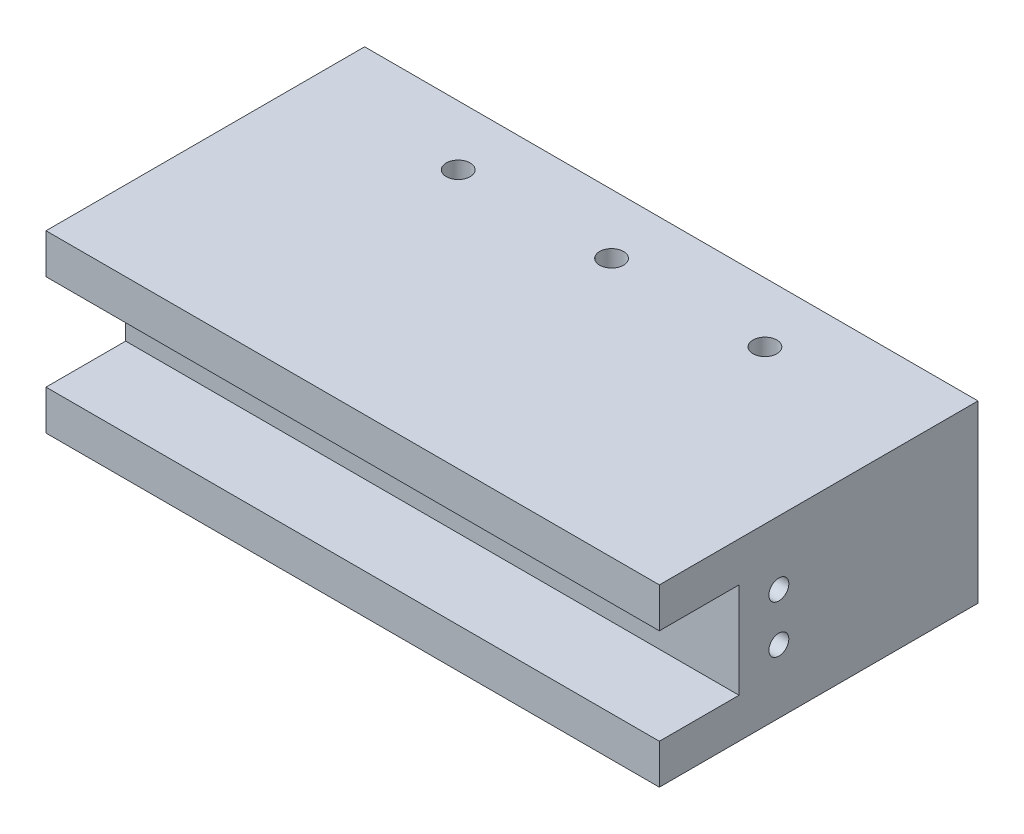
ISO-10303-21;
HEADER;
FILE_DESCRIPTION(('STEP AP214'),'2;1');
FILE_NAME('part.step','',(''),(''),'','','');
FILE_SCHEMA(('AUTOMOTIVE_DESIGN { 1 0 10303 214 1 1 1 1 }'));
ENDSEC;
DATA;
#1=APPLICATION_CONTEXT('core data for automotive mechanical design processes');
#2=APPLICATION_PROTOCOL_DEFINITION('international standard','automotive_design',2000,#1);
#3=PRODUCT_CONTEXT('',#1,'mechanical');
#4=PRODUCT('Part','Part','',(#3));
#5=PRODUCT_RELATED_PRODUCT_CATEGORY('part','',(#4));
#6=PRODUCT_DEFINITION_FORMATION('','',#4);
#7=PRODUCT_DEFINITION_CONTEXT('part definition',#1,'design');
#8=PRODUCT_DEFINITION('design','',#6,#7);
#9=PRODUCT_DEFINITION_SHAPE('','',#8);
#10=(LENGTH_UNIT() NAMED_UNIT(*) SI_UNIT(.MILLI.,.METRE.));
#11=(NAMED_UNIT(*) PLANE_ANGLE_UNIT() SI_UNIT($,.RADIAN.));
#12=(NAMED_UNIT(*) SI_UNIT($,.STERADIAN.) SOLID_ANGLE_UNIT());
#13=UNCERTAINTY_MEASURE_WITH_UNIT(LENGTH_MEASURE(1.E-05),#10,'distance_accuracy_value','');
#14=(GEOMETRIC_REPRESENTATION_CONTEXT(3) GLOBAL_UNCERTAINTY_ASSIGNED_CONTEXT((#13)) GLOBAL_UNIT_ASSIGNED_CONTEXT((#10,
#11,#12)) REPRESENTATION_CONTEXT('',''));
#15=CARTESIAN_POINT('',(0.,0.,0.));
#16=DIRECTION('',(0.,0.,1.));
#17=DIRECTION('',(1.,0.,0.));
#18=AXIS2_PLACEMENT_3D('',#15,#16,#17);
#19=CARTESIAN_POINT('',(0.,0.,10.));
#20=DIRECTION('',(1.,0.,0.));
#21=DIRECTION('',(0.,0.,-1.));
#22=AXIS2_PLACEMENT_3D('',#19,#20,#21);
#23=PLANE('',#22);
#24=CARTESIAN_POINT('',(0.,6.,6.));
#25=DIRECTION('',(-1.,0.,0.));
#26=DIRECTION('',(0.,0.,1.));
#27=AXIS2_PLACEMENT_3D('',#24,#25,#26);
#28=CIRCLE('',#27,1.25);
#29=CARTESIAN_POINT('',(0.,6.,7.25));
#30=VERTEX_POINT('',#29);
#31=EDGE_CURVE('E133',#30,#30,#28,.T.);
#32=ORIENTED_EDGE('',*,*,#31,.F.);
#33=EDGE_LOOP('',(#32));
#34=FACE_BOUND('',#33,.T.);
#35=DIRECTION('',(0.,0.,1.));
#36=VECTOR('',#35,1.);
#37=CARTESIAN_POINT('',(0.,17.,0.));
#38=LINE('',#37,#36);
#39=CARTESIAN_POINT('',(0.,17.,-20.));
#40=VERTEX_POINT('',#39);
#41=CARTESIAN_POINT('',(0.,17.,20.));
#42=VERTEX_POINT('',#41);
#43=EDGE_CURVE('E97',#40,#42,#38,.T.);
#44=ORIENTED_EDGE('',*,*,#43,.F.);
#45=DIRECTION('',(0.,1.,0.));
#46=VECTOR('',#45,1.);
#47=CARTESIAN_POINT('',(0.,-5.,-20.));
#48=LINE('',#47,#46);
#49=CARTESIAN_POINT('',(0.,-5.,-20.));
#50=VERTEX_POINT('',#49);
#51=EDGE_CURVE('E101',#50,#40,#48,.T.);
#52=ORIENTED_EDGE('',*,*,#51,.F.);
#53=DIRECTION('',(0.,0.,1.));
#54=VECTOR('',#53,1.);
#55=CARTESIAN_POINT('',(0.,-5.,0.));
#56=LINE('',#55,#54);
#57=CARTESIAN_POINT('',(0.,-5.,20.));
#58=VERTEX_POINT('',#57);
#59=EDGE_CURVE('E145',#50,#58,#56,.T.);
#60=ORIENTED_EDGE('',*,*,#59,.T.);
#61=DIRECTION('',(0.,1.,0.));
#62=VECTOR('',#61,1.);
#63=CARTESIAN_POINT('',(0.,-5.,20.));
#64=LINE('',#63,#62);
#65=CARTESIAN_POINT('',(0.,0.,20.));
#66=VERTEX_POINT('',#65);
#67=EDGE_CURVE('E147',#58,#66,#64,.T.);
#68=ORIENTED_EDGE('',*,*,#67,.T.);
#69=DIRECTION('',(0.,0.,1.));
#70=VECTOR('',#69,1.);
#71=CARTESIAN_POINT('',(0.,0.,0.));
#72=LINE('',#71,#70);
#73=CARTESIAN_POINT('',(0.,0.,10.));
#74=VERTEX_POINT('',#73);
#75=EDGE_CURVE('E142',#74,#66,#72,.T.);
#76=ORIENTED_EDGE('',*,*,#75,.F.);
#77=DIRECTION('',(0.,-1.,0.));
#78=VECTOR('',#77,1.);
#79=CARTESIAN_POINT('',(0.,0.,10.));
#80=LINE('',#79,#78);
#81=CARTESIAN_POINT('',(0.,12.,10.));
#82=VERTEX_POINT('',#81);
#83=EDGE_CURVE('E172',#82,#74,#80,.T.);
#84=ORIENTED_EDGE('',*,*,#83,.F.);
#85=DIRECTION('',(0.,0.,1.));
#86=VECTOR('',#85,1.);
#87=CARTESIAN_POINT('',(0.,12.,0.));
#88=LINE('',#87,#86);
#89=CARTESIAN_POINT('',(0.,12.,20.));
#90=VERTEX_POINT('',#89);
#91=EDGE_CURVE('E47',#82,#90,#88,.T.);
#92=ORIENTED_EDGE('',*,*,#91,.T.);
#93=DIRECTION('',(0.,-1.,0.));
#94=VECTOR('',#93,1.);
#95=CARTESIAN_POINT('',(0.,17.,20.));
#96=LINE('',#95,#94);
#97=EDGE_CURVE('E103',#42,#90,#96,.T.);
#98=ORIENTED_EDGE('',*,*,#97,.F.);
#99=EDGE_LOOP('',(#44,#52,#60,#68,#76,#84,#92,#98));
#100=FACE_BOUND('',#99,.T.);
#101=ADVANCED_FACE('F33',(#34,#100),#23,.F.);
#102=CARTESIAN_POINT('',(77.,0.,10.));
#103=DIRECTION('',(-1.,0.,0.));
#104=DIRECTION('',(0.,0.,1.));
#105=AXIS2_PLACEMENT_3D('',#102,#103,#104);
#106=PLANE('',#105);
#107=CARTESIAN_POINT('',(77.,3.,5.));
#108=DIRECTION('',(1.,0.,0.));
#109=DIRECTION('',(0.,0.,-1.));
#110=AXIS2_PLACEMENT_3D('',#107,#108,#109);
#111=CIRCLE('',#110,1.25);
#112=CARTESIAN_POINT('',(77.,3.,3.75));
#113=VERTEX_POINT('',#112);
#114=EDGE_CURVE('E173',#113,#113,#111,.T.);
#115=ORIENTED_EDGE('',*,*,#114,.F.);
#116=EDGE_LOOP('',(#115));
#117=FACE_BOUND('',#116,.T.);
#118=CARTESIAN_POINT('',(77.,9.,5.));
#119=DIRECTION('',(1.,0.,0.));
#120=DIRECTION('',(0.,0.,-1.));
#121=AXIS2_PLACEMENT_3D('',#118,#119,#120);
#122=CIRCLE('',#121,1.25);
#123=CARTESIAN_POINT('',(77.,9.,3.75));
#124=VERTEX_POINT('',#123);
#125=EDGE_CURVE('E176',#124,#124,#122,.T.);
#126=ORIENTED_EDGE('',*,*,#125,.F.);
#127=EDGE_LOOP('',(#126));
#128=FACE_BOUND('',#127,.T.);
#129=DIRECTION('',(0.,0.,-1.));
#130=VECTOR('',#129,1.);
#131=CARTESIAN_POINT('',(77.,-5.,0.));
#132=LINE('',#131,#130);
#133=CARTESIAN_POINT('',(77.,-5.,20.));
#134=VERTEX_POINT('',#133);
#135=CARTESIAN_POINT('',(77.,-5.,-20.));
#136=VERTEX_POINT('',#135);
#137=EDGE_CURVE('E139',#134,#136,#132,.T.);
#138=ORIENTED_EDGE('',*,*,#137,.T.);
#139=DIRECTION('',(0.,-1.,0.));
#140=VECTOR('',#139,1.);
#141=CARTESIAN_POINT('',(77.,-5.,-20.));
#142=LINE('',#141,#140);
#143=CARTESIAN_POINT('',(77.,17.,-20.));
#144=VERTEX_POINT('',#143);
#145=EDGE_CURVE('E116',#144,#136,#142,.T.);
#146=ORIENTED_EDGE('',*,*,#145,.F.);
#147=DIRECTION('',(0.,0.,-1.));
#148=VECTOR('',#147,1.);
#149=CARTESIAN_POINT('',(77.,17.,0.));
#150=LINE('',#149,#148);
#151=CARTESIAN_POINT('',(77.,17.,20.));
#152=VERTEX_POINT('',#151);
#153=EDGE_CURVE('E107',#152,#144,#150,.T.);
#154=ORIENTED_EDGE('',*,*,#153,.F.);
#155=DIRECTION('',(0.,-1.,0.));
#156=VECTOR('',#155,1.);
#157=CARTESIAN_POINT('',(77.,17.,20.));
#158=LINE('',#157,#156);
#159=CARTESIAN_POINT('',(77.,12.,20.));
#160=VERTEX_POINT('',#159);
#161=EDGE_CURVE('E160',#152,#160,#158,.T.);
#162=ORIENTED_EDGE('',*,*,#161,.T.);
#163=DIRECTION('',(0.,0.,-1.));
#164=VECTOR('',#163,1.);
#165=CARTESIAN_POINT('',(77.,12.,0.));
#166=LINE('',#165,#164);
#167=CARTESIAN_POINT('',(77.,12.,10.));
#168=VERTEX_POINT('',#167);
#169=EDGE_CURVE('E156',#160,#168,#166,.T.);
#170=ORIENTED_EDGE('',*,*,#169,.T.);
#171=DIRECTION('',(0.,1.,0.));
#172=VECTOR('',#171,1.);
#173=CARTESIAN_POINT('',(77.,0.,10.));
#174=LINE('',#173,#172);
#175=CARTESIAN_POINT('',(77.,0.,10.));
#176=VERTEX_POINT('',#175);
#177=EDGE_CURVE('E40',#176,#168,#174,.T.);
#178=ORIENTED_EDGE('',*,*,#177,.F.);
#179=DIRECTION('',(0.,0.,-1.));
#180=VECTOR('',#179,1.);
#181=CARTESIAN_POINT('',(77.,0.,0.));
#182=LINE('',#181,#180);
#183=CARTESIAN_POINT('',(77.,0.,20.));
#184=VERTEX_POINT('',#183);
#185=EDGE_CURVE('E54',#184,#176,#182,.T.);
#186=ORIENTED_EDGE('',*,*,#185,.F.);
#187=DIRECTION('',(0.,1.,0.));
#188=VECTOR('',#187,1.);
#189=CARTESIAN_POINT('',(77.,-5.,20.));
#190=LINE('',#189,#188);
#191=EDGE_CURVE('E154',#134,#184,#190,.T.);
#192=ORIENTED_EDGE('',*,*,#191,.F.);
#193=EDGE_LOOP('',(#138,#146,#154,#162,#170,#178,#186,#192));
#194=FACE_BOUND('',#193,.T.);
#195=ADVANCED_FACE('F190',(#117,#128,#194),#106,.F.);
#196=CARTESIAN_POINT('',(0.,0.,10.));
#197=DIRECTION('',(0.,0.,-1.));
#198=DIRECTION('',(-1.,0.,0.));
#199=AXIS2_PLACEMENT_3D('',#196,#197,#198);
#200=PLANE('',#199);
#201=ORIENTED_EDGE('',*,*,#83,.T.);
#202=DIRECTION('',(1.,0.,0.));
#203=VECTOR('',#202,1.);
#204=CARTESIAN_POINT('',(0.,0.,10.));
#205=LINE('',#204,#203);
#206=EDGE_CURVE('E183',#74,#176,#205,.T.);
#207=ORIENTED_EDGE('',*,*,#206,.T.);
#208=ORIENTED_EDGE('',*,*,#177,.T.);
#209=DIRECTION('',(-1.,0.,0.));
#210=VECTOR('',#209,1.);
#211=CARTESIAN_POINT('',(0.,12.,10.));
#212=LINE('',#211,#210);
#213=EDGE_CURVE('E11',#168,#82,#212,.T.);
#214=ORIENTED_EDGE('',*,*,#213,.T.);
#215=EDGE_LOOP('',(#201,#207,#208,#214));
#216=FACE_BOUND('',#215,.T.);
#217=ADVANCED_FACE('F187',(#216),#200,.F.);
#218=CARTESIAN_POINT('',(65.,9.,5.));
#219=DIRECTION('',(1.,0.,0.));
#220=DIRECTION('',(0.,0.,-1.));
#221=AXIS2_PLACEMENT_3D('',#218,#219,#220);
#222=CYLINDRICAL_SURFACE('',#221,1.25);
#223=CARTESIAN_POINT('',(65.,9.,5.));
#224=DIRECTION('',(1.,0.,0.));
#225=DIRECTION('',(0.,0.,-1.));
#226=AXIS2_PLACEMENT_3D('',#223,#224,#225);
#227=CIRCLE('',#226,1.25);
#228=CARTESIAN_POINT('',(65.,9.,3.75));
#229=VERTEX_POINT('',#228);
#230=EDGE_CURVE('E168',#229,#229,#227,.T.);
#231=ORIENTED_EDGE('',*,*,#230,.F.);
#232=EDGE_LOOP('',(#231));
#233=FACE_BOUND('',#232,.T.);
#234=ORIENTED_EDGE('',*,*,#125,.T.);
#235=EDGE_LOOP('',(#234));
#236=FACE_BOUND('',#235,.T.);
#237=ADVANCED_FACE('F344',(#233,#236),#222,.F.);
#238=CARTESIAN_POINT('',(65.,9.,5.));
#239=DIRECTION('',(1.,0.,0.));
#240=DIRECTION('',(0.,0.,-1.));
#241=AXIS2_PLACEMENT_3D('',#238,#239,#240);
#242=PLANE('',#241);
#243=ORIENTED_EDGE('',*,*,#230,.T.);
#244=EDGE_LOOP('',(#243));
#245=FACE_BOUND('',#244,.T.);
#246=ADVANCED_FACE('F385',(#245),#242,.T.);
#247=CARTESIAN_POINT('',(65.,3.,5.));
#248=DIRECTION('',(1.,0.,0.));
#249=DIRECTION('',(0.,0.,-1.));
#250=AXIS2_PLACEMENT_3D('',#247,#248,#249);
#251=CYLINDRICAL_SURFACE('',#250,1.25);
#252=CARTESIAN_POINT('',(65.,3.,5.));
#253=DIRECTION('',(1.,0.,0.));
#254=DIRECTION('',(0.,0.,-1.));
#255=AXIS2_PLACEMENT_3D('',#252,#253,#254);
#256=CIRCLE('',#255,1.25);
#257=CARTESIAN_POINT('',(65.,3.,3.75));
#258=VERTEX_POINT('',#257);
#259=EDGE_CURVE('E169',#258,#258,#256,.T.);
#260=ORIENTED_EDGE('',*,*,#259,.F.);
#261=EDGE_LOOP('',(#260));
#262=FACE_BOUND('',#261,.T.);
#263=ORIENTED_EDGE('',*,*,#114,.T.);
#264=EDGE_LOOP('',(#263));
#265=FACE_BOUND('',#264,.T.);
#266=ADVANCED_FACE('F374',(#262,#265),#251,.F.);
#267=CARTESIAN_POINT('',(65.,3.,5.));
#268=DIRECTION('',(1.,0.,0.));
#269=DIRECTION('',(0.,0.,-1.));
#270=AXIS2_PLACEMENT_3D('',#267,#268,#269);
#271=PLANE('',#270);
#272=ORIENTED_EDGE('',*,*,#259,.T.);
#273=EDGE_LOOP('',(#272));
#274=FACE_BOUND('',#273,.T.);
#275=ADVANCED_FACE('F364',(#274),#271,.T.);
#276=CARTESIAN_POINT('',(0.,12.,0.));
#277=DIRECTION('',(0.,-1.,0.));
#278=DIRECTION('',(1.,0.,0.));
#279=AXIS2_PLACEMENT_3D('',#276,#277,#278);
#280=PLANE('',#279);
#281=ORIENTED_EDGE('',*,*,#213,.F.);
#282=ORIENTED_EDGE('',*,*,#169,.F.);
#283=DIRECTION('',(1.,0.,0.));
#284=VECTOR('',#283,1.);
#285=CARTESIAN_POINT('',(77.,12.,20.));
#286=LINE('',#285,#284);
#287=EDGE_CURVE('E157',#90,#160,#286,.T.);
#288=ORIENTED_EDGE('',*,*,#287,.F.);
#289=ORIENTED_EDGE('',*,*,#91,.F.);
#290=EDGE_LOOP('',(#281,#282,#288,#289));
#291=FACE_BOUND('',#290,.T.);
#292=ADVANCED_FACE('F193',(#291),#280,.T.);
#293=CARTESIAN_POINT('',(77.,17.,20.));
#294=DIRECTION('',(0.,0.,-1.));
#295=DIRECTION('',(-1.,0.,0.));
#296=AXIS2_PLACEMENT_3D('',#293,#294,#295);
#297=PLANE('',#296);
#298=ORIENTED_EDGE('',*,*,#287,.T.);
#299=ORIENTED_EDGE('',*,*,#161,.F.);
#300=DIRECTION('',(1.,0.,0.));
#301=VECTOR('',#300,1.);
#302=CARTESIAN_POINT('',(77.,17.,20.));
#303=LINE('',#302,#301);
#304=EDGE_CURVE('E106',#42,#152,#303,.T.);
#305=ORIENTED_EDGE('',*,*,#304,.F.);
#306=ORIENTED_EDGE('',*,*,#97,.T.);
#307=EDGE_LOOP('',(#298,#299,#305,#306));
#308=FACE_BOUND('',#307,.T.);
#309=ADVANCED_FACE('F195',(#308),#297,.F.);
#310=CARTESIAN_POINT('',(0.,17.,0.));
#311=DIRECTION('',(0.,-1.,0.));
#312=DIRECTION('',(1.,0.,0.));
#313=AXIS2_PLACEMENT_3D('',#310,#311,#312);
#314=PLANE('',#313);
#315=CARTESIAN_POINT('',(19.25,17.,-12.5));
#316=DIRECTION('',(0.,-1.,0.));
#317=DIRECTION('',(1.,0.,0.));
#318=AXIS2_PLACEMENT_3D('',#315,#316,#317);
#319=CIRCLE('',#318,1.5);
#320=CARTESIAN_POINT('',(20.75,17.,-12.5));
#321=VERTEX_POINT('',#320);
#322=EDGE_CURVE('E122',#321,#321,#319,.T.);
#323=ORIENTED_EDGE('',*,*,#322,.T.);
#324=EDGE_LOOP('',(#323));
#325=FACE_BOUND('',#324,.T.);
#326=CARTESIAN_POINT('',(38.5,17.,-12.5));
#327=DIRECTION('',(0.,-1.,0.));
#328=DIRECTION('',(1.,0.,0.));
#329=AXIS2_PLACEMENT_3D('',#326,#327,#328);
#330=CIRCLE('',#329,1.5);
#331=CARTESIAN_POINT('',(40.,17.,-12.5));
#332=VERTEX_POINT('',#331);
#333=EDGE_CURVE('E260',#332,#332,#330,.T.);
#334=ORIENTED_EDGE('',*,*,#333,.T.);
#335=EDGE_LOOP('',(#334));
#336=FACE_BOUND('',#335,.T.);
#337=CARTESIAN_POINT('',(57.75,17.,-12.5));
#338=DIRECTION('',(0.,-1.,0.));
#339=DIRECTION('',(1.,0.,0.));
#340=AXIS2_PLACEMENT_3D('',#337,#338,#339);
#341=CIRCLE('',#340,1.5);
#342=CARTESIAN_POINT('',(59.25,17.,-12.5));
#343=VERTEX_POINT('',#342);
#344=EDGE_CURVE('E128',#343,#343,#341,.T.);
#345=ORIENTED_EDGE('',*,*,#344,.T.);
#346=EDGE_LOOP('',(#345));
#347=FACE_BOUND('',#346,.T.);
#348=ORIENTED_EDGE('',*,*,#153,.T.);
#349=DIRECTION('',(1.,0.,0.));
#350=VECTOR('',#349,1.);
#351=CARTESIAN_POINT('',(0.,17.,-20.));
#352=LINE('',#351,#350);
#353=EDGE_CURVE('E110',#40,#144,#352,.T.);
#354=ORIENTED_EDGE('',*,*,#353,.F.);
#355=ORIENTED_EDGE('',*,*,#43,.T.);
#356=ORIENTED_EDGE('',*,*,#304,.T.);
#357=EDGE_LOOP('',(#348,#354,#355,#356));
#358=FACE_BOUND('',#357,.T.);
#359=ADVANCED_FACE('F111',(#325,#336,#347,#358),#314,.F.);
#360=CARTESIAN_POINT('',(0.,0.,0.));
#361=DIRECTION('',(0.,1.,0.));
#362=DIRECTION('',(1.,0.,0.));
#363=AXIS2_PLACEMENT_3D('',#360,#361,#362);
#364=PLANE('',#363);
#365=ORIENTED_EDGE('',*,*,#206,.F.);
#366=ORIENTED_EDGE('',*,*,#75,.T.);
#367=DIRECTION('',(1.,0.,0.));
#368=VECTOR('',#367,1.);
#369=CARTESIAN_POINT('',(77.,0.,20.));
#370=LINE('',#369,#368);
#371=EDGE_CURVE('E149',#66,#184,#370,.T.);
#372=ORIENTED_EDGE('',*,*,#371,.T.);
#373=ORIENTED_EDGE('',*,*,#185,.T.);
#374=EDGE_LOOP('',(#365,#366,#372,#373));
#375=FACE_BOUND('',#374,.T.);
#376=ADVANCED_FACE('F204',(#375),#364,.T.);
#377=CARTESIAN_POINT('',(77.,-5.,20.));
#378=DIRECTION('',(0.,0.,1.));
#379=DIRECTION('',(1.,0.,0.));
#380=AXIS2_PLACEMENT_3D('',#377,#378,#379);
#381=PLANE('',#380);
#382=ORIENTED_EDGE('',*,*,#371,.F.);
#383=ORIENTED_EDGE('',*,*,#67,.F.);
#384=DIRECTION('',(1.,0.,0.));
#385=VECTOR('',#384,1.);
#386=CARTESIAN_POINT('',(77.,-5.,20.));
#387=LINE('',#386,#385);
#388=EDGE_CURVE('E141',#58,#134,#387,.T.);
#389=ORIENTED_EDGE('',*,*,#388,.T.);
#390=ORIENTED_EDGE('',*,*,#191,.T.);
#391=EDGE_LOOP('',(#382,#383,#389,#390));
#392=FACE_BOUND('',#391,.T.);
#393=ADVANCED_FACE('F203',(#392),#381,.T.);
#394=CARTESIAN_POINT('',(0.,-5.,0.));
#395=DIRECTION('',(0.,1.,0.));
#396=DIRECTION('',(1.,0.,0.));
#397=AXIS2_PLACEMENT_3D('',#394,#395,#396);
#398=PLANE('',#397);
#399=CARTESIAN_POINT('',(19.25,-5.,-12.5));
#400=DIRECTION('',(0.,-1.,0.));
#401=DIRECTION('',(1.,0.,0.));
#402=AXIS2_PLACEMENT_3D('',#399,#400,#401);
#403=CIRCLE('',#402,1.5);
#404=CARTESIAN_POINT('',(20.75,-5.,-12.5));
#405=VERTEX_POINT('',#404);
#406=EDGE_CURVE('E125',#405,#405,#403,.T.);
#407=ORIENTED_EDGE('',*,*,#406,.F.);
#408=EDGE_LOOP('',(#407));
#409=FACE_BOUND('',#408,.T.);
#410=CARTESIAN_POINT('',(38.5,-5.,-12.5));
#411=DIRECTION('',(0.,-1.,0.));
#412=DIRECTION('',(1.,0.,0.));
#413=AXIS2_PLACEMENT_3D('',#410,#411,#412);
#414=CIRCLE('',#413,1.5);
#415=CARTESIAN_POINT('',(40.,-5.,-12.5));
#416=VERTEX_POINT('',#415);
#417=EDGE_CURVE('E257',#416,#416,#414,.T.);
#418=ORIENTED_EDGE('',*,*,#417,.F.);
#419=EDGE_LOOP('',(#418));
#420=FACE_BOUND('',#419,.T.);
#421=CARTESIAN_POINT('',(57.75,-5.,-12.5));
#422=DIRECTION('',(0.,-1.,0.));
#423=DIRECTION('',(1.,0.,0.));
#424=AXIS2_PLACEMENT_3D('',#421,#422,#423);
#425=CIRCLE('',#424,1.5);
#426=CARTESIAN_POINT('',(59.25,-5.,-12.5));
#427=VERTEX_POINT('',#426);
#428=EDGE_CURVE('E264',#427,#427,#425,.T.);
#429=ORIENTED_EDGE('',*,*,#428,.F.);
#430=EDGE_LOOP('',(#429));
#431=FACE_BOUND('',#430,.T.);
#432=ORIENTED_EDGE('',*,*,#137,.F.);
#433=ORIENTED_EDGE('',*,*,#388,.F.);
#434=ORIENTED_EDGE('',*,*,#59,.F.);
#435=DIRECTION('',(-1.,0.,0.));
#436=VECTOR('',#435,1.);
#437=CARTESIAN_POINT('',(0.,-5.,-20.));
#438=LINE('',#437,#436);
#439=EDGE_CURVE('E121',#136,#50,#438,.T.);
#440=ORIENTED_EDGE('',*,*,#439,.F.);
#441=EDGE_LOOP('',(#432,#433,#434,#440));
#442=FACE_BOUND('',#441,.T.);
#443=ADVANCED_FACE('F198',(#409,#420,#431,#442),#398,.F.);
#444=CARTESIAN_POINT('',(12.,6.,6.));
#445=DIRECTION('',(-1.,0.,0.));
#446=DIRECTION('',(0.,0.,1.));
#447=AXIS2_PLACEMENT_3D('',#444,#445,#446);
#448=CYLINDRICAL_SURFACE('',#447,1.25);
#449=CARTESIAN_POINT('',(12.,6.,6.));
#450=DIRECTION('',(-1.,0.,0.));
#451=DIRECTION('',(0.,0.,1.));
#452=AXIS2_PLACEMENT_3D('',#449,#450,#451);
#453=CIRCLE('',#452,1.25);
#454=CARTESIAN_POINT('',(12.,6.,7.25));
#455=VERTEX_POINT('',#454);
#456=EDGE_CURVE('E134',#455,#455,#453,.T.);
#457=ORIENTED_EDGE('',*,*,#456,.F.);
#458=EDGE_LOOP('',(#457));
#459=FACE_BOUND('',#458,.T.);
#460=ORIENTED_EDGE('',*,*,#31,.T.);
#461=EDGE_LOOP('',(#460));
#462=FACE_BOUND('',#461,.T.);
#463=ADVANCED_FACE('F225',(#459,#462),#448,.F.);
#464=CARTESIAN_POINT('',(12.,6.,6.));
#465=DIRECTION('',(-1.,0.,0.));
#466=DIRECTION('',(0.,0.,1.));
#467=AXIS2_PLACEMENT_3D('',#464,#465,#466);
#468=PLANE('',#467);
#469=ORIENTED_EDGE('',*,*,#456,.T.);
#470=EDGE_LOOP('',(#469));
#471=FACE_BOUND('',#470,.T.);
#472=ADVANCED_FACE('F227',(#471),#468,.T.);
#473=CARTESIAN_POINT('',(0.,0.,-20.));
#474=DIRECTION('',(0.,0.,-1.));
#475=DIRECTION('',(-1.,0.,0.));
#476=AXIS2_PLACEMENT_3D('',#473,#474,#475);
#477=PLANE('',#476);
#478=ORIENTED_EDGE('',*,*,#51,.T.);
#479=ORIENTED_EDGE('',*,*,#353,.T.);
#480=ORIENTED_EDGE('',*,*,#145,.T.);
#481=ORIENTED_EDGE('',*,*,#439,.T.);
#482=EDGE_LOOP('',(#478,#479,#480,#481));
#483=FACE_BOUND('',#482,.T.);
#484=ADVANCED_FACE('F119',(#483),#477,.T.);
#485=CARTESIAN_POINT('',(57.75,17.,-12.5));
#486=DIRECTION('',(0.,-1.,0.));
#487=DIRECTION('',(1.,0.,0.));
#488=AXIS2_PLACEMENT_3D('',#485,#486,#487);
#489=CYLINDRICAL_SURFACE('',#488,1.5);
#490=ORIENTED_EDGE('',*,*,#344,.F.);
#491=EDGE_LOOP('',(#490));
#492=FACE_BOUND('',#491,.T.);
#493=ORIENTED_EDGE('',*,*,#428,.T.);
#494=EDGE_LOOP('',(#493));
#495=FACE_BOUND('',#494,.T.);
#496=ADVANCED_FACE('F240',(#492,#495),#489,.F.);
#497=CARTESIAN_POINT('',(38.5,17.,-12.5));
#498=DIRECTION('',(0.,-1.,0.));
#499=DIRECTION('',(1.,0.,0.));
#500=AXIS2_PLACEMENT_3D('',#497,#498,#499);
#501=CYLINDRICAL_SURFACE('',#500,1.5);
#502=ORIENTED_EDGE('',*,*,#333,.F.);
#503=EDGE_LOOP('',(#502));
#504=FACE_BOUND('',#503,.T.);
#505=ORIENTED_EDGE('',*,*,#417,.T.);
#506=EDGE_LOOP('',(#505));
#507=FACE_BOUND('',#506,.T.);
#508=ADVANCED_FACE('F243',(#504,#507),#501,.F.);
#509=CARTESIAN_POINT('',(19.25,17.,-12.5));
#510=DIRECTION('',(0.,-1.,0.));
#511=DIRECTION('',(1.,0.,0.));
#512=AXIS2_PLACEMENT_3D('',#509,#510,#511);
#513=CYLINDRICAL_SURFACE('',#512,1.5);
#514=ORIENTED_EDGE('',*,*,#322,.F.);
#515=EDGE_LOOP('',(#514));
#516=FACE_BOUND('',#515,.T.);
#517=ORIENTED_EDGE('',*,*,#406,.T.);
#518=EDGE_LOOP('',(#517));
#519=FACE_BOUND('',#518,.T.);
#520=ADVANCED_FACE('F247',(#516,#519),#513,.F.);
#521=CLOSED_SHELL('',(#101,#195,#217,#237,#246,#266,#275,#292,#309,#359,#376,#393,#443,#463,
#472,#484,#496,#508,#520));
#522=MANIFOLD_SOLID_BREP('B2',#521);
#523=ADVANCED_BREP_SHAPE_REPRESENTATION('',(#18,#522),#14);
#524=SHAPE_DEFINITION_REPRESENTATION(#9,#523);
ENDSEC;
END-ISO-10303-21;
